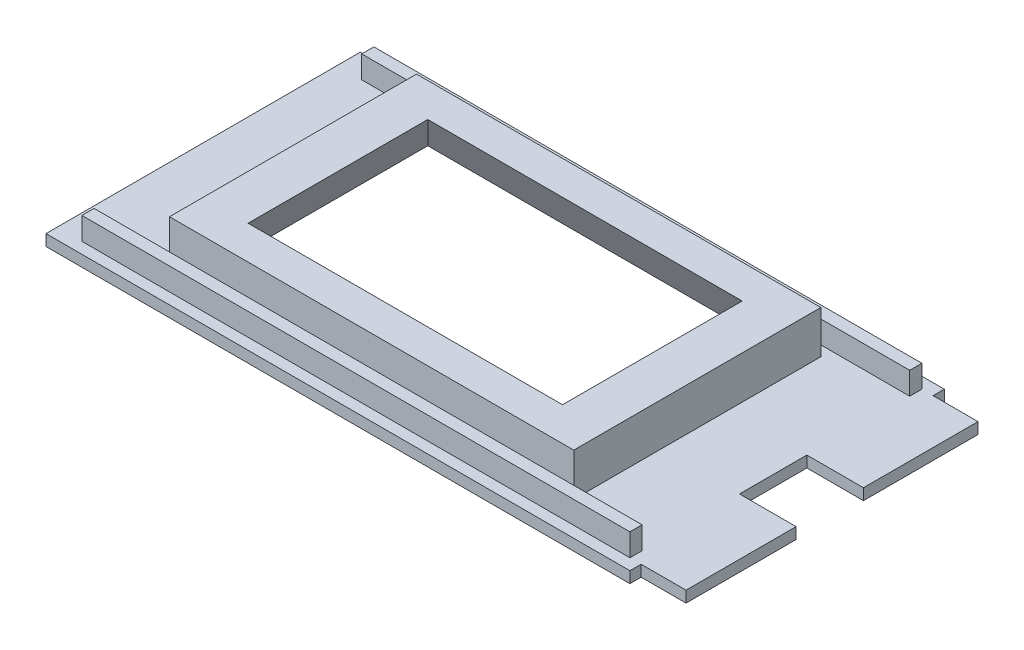
ISO-10303-21;
HEADER;
FILE_DESCRIPTION(('STEP AP214'),'2;1');
FILE_NAME('part.step','',(''),(''),'','','');
FILE_SCHEMA(('AUTOMOTIVE_DESIGN { 1 0 10303 214 1 1 1 1 }'));
ENDSEC;
DATA;
#1=APPLICATION_CONTEXT('core data for automotive mechanical design processes');
#2=APPLICATION_PROTOCOL_DEFINITION('international standard','automotive_design',2000,#1);
#3=PRODUCT_CONTEXT('',#1,'mechanical');
#4=PRODUCT('Part','Part','',(#3));
#5=PRODUCT_RELATED_PRODUCT_CATEGORY('part','',(#4));
#6=PRODUCT_DEFINITION_FORMATION('','',#4);
#7=PRODUCT_DEFINITION_CONTEXT('part definition',#1,'design');
#8=PRODUCT_DEFINITION('design','',#6,#7);
#9=PRODUCT_DEFINITION_SHAPE('','',#8);
#10=(LENGTH_UNIT() NAMED_UNIT(*) SI_UNIT(.MILLI.,.METRE.));
#11=(NAMED_UNIT(*) PLANE_ANGLE_UNIT() SI_UNIT($,.RADIAN.));
#12=(NAMED_UNIT(*) SI_UNIT($,.STERADIAN.) SOLID_ANGLE_UNIT());
#13=UNCERTAINTY_MEASURE_WITH_UNIT(LENGTH_MEASURE(1.E-05),#10,'distance_accuracy_value','');
#14=(GEOMETRIC_REPRESENTATION_CONTEXT(3) GLOBAL_UNCERTAINTY_ASSIGNED_CONTEXT((#13)) GLOBAL_UNIT_ASSIGNED_CONTEXT((#10,
#11,#12)) REPRESENTATION_CONTEXT('',''));
#15=CARTESIAN_POINT('',(0.,0.,0.));
#16=DIRECTION('',(0.,0.,1.));
#17=DIRECTION('',(1.,0.,0.));
#18=AXIS2_PLACEMENT_3D('',#15,#16,#17);
#19=CARTESIAN_POINT('',(0.,3.175,0.));
#20=DIRECTION('',(0.,-1.,0.));
#21=DIRECTION('',(0.,0.,-1.));
#22=AXIS2_PLACEMENT_3D('',#19,#20,#21);
#23=PLANE('',#22);
#24=DIRECTION('',(0.,0.,1.));
#25=VECTOR('',#24,1.);
#26=CARTESIAN_POINT('',(-75.565,3.175,41.275));
#27=LINE('',#26,#25);
#28=CARTESIAN_POINT('',(-75.565,3.175,37.8379198612695));
#29=VERTEX_POINT('',#28);
#30=CARTESIAN_POINT('',(-75.565,3.175,41.275));
#31=VERTEX_POINT('',#30);
#32=EDGE_CURVE('E317',#29,#31,#27,.T.);
#33=ORIENTED_EDGE('',*,*,#32,.F.);
#34=DIRECTION('',(-1.,0.,0.));
#35=VECTOR('',#34,1.);
#36=CARTESIAN_POINT('',(-75.565,3.175,37.8379198612695));
#37=LINE('',#36,#35);
#38=CARTESIAN_POINT('',(79.3749999999999,3.175,37.8379198612695));
#39=VERTEX_POINT('',#38);
#40=EDGE_CURVE('E323',#39,#29,#37,.T.);
#41=ORIENTED_EDGE('',*,*,#40,.F.);
#42=DIRECTION('',(0.,0.,-1.));
#43=VECTOR('',#42,1.);
#44=CARTESIAN_POINT('',(79.3749999999999,3.175,41.275));
#45=LINE('',#44,#43);
#46=CARTESIAN_POINT('',(79.3749999999999,3.175,41.275));
#47=VERTEX_POINT('',#46);
#48=EDGE_CURVE('E340',#47,#39,#45,.T.);
#49=ORIENTED_EDGE('',*,*,#48,.F.);
#50=DIRECTION('',(1.,0.,0.));
#51=VECTOR('',#50,1.);
#52=CARTESIAN_POINT('',(-75.565,3.175,41.275));
#53=LINE('',#52,#51);
#54=EDGE_CURVE('E336',#31,#47,#53,.T.);
#55=ORIENTED_EDGE('',*,*,#54,.F.);
#56=EDGE_LOOP('',(#33,#41,#49,#55));
#57=FACE_BOUND('',#56,.T.);
#58=DIRECTION('',(0.,0.,1.));
#59=VECTOR('',#58,1.);
#60=CARTESIAN_POINT('',(79.248,3.17499999999999,-8.89));
#61=LINE('',#60,#59);
#62=CARTESIAN_POINT('',(79.248,3.17499999999999,-8.89));
#63=VERTEX_POINT('',#62);
#64=CARTESIAN_POINT('',(79.248,3.17500000000003,10.16));
#65=VERTEX_POINT('',#64);
#66=EDGE_CURVE('E412',#63,#65,#61,.T.);
#67=ORIENTED_EDGE('',*,*,#66,.F.);
#68=DIRECTION('',(1.,0.,0.));
#69=VECTOR('',#68,1.);
#70=CARTESIAN_POINT('',(79.248,3.17499999999999,-8.89));
#71=LINE('',#70,#69);
#72=CARTESIAN_POINT('',(95.25,3.17499999999999,-8.89));
#73=VERTEX_POINT('',#72);
#74=EDGE_CURVE('E425',#63,#73,#71,.T.);
#75=ORIENTED_EDGE('',*,*,#74,.T.);
#76=DIRECTION('',(0.,0.,1.));
#77=VECTOR('',#76,1.);
#78=CARTESIAN_POINT('',(95.25,3.17500000000003,-41.275));
#79=LINE('',#78,#77);
#80=CARTESIAN_POINT('',(95.25,3.17500000000003,-41.275));
#81=VERTEX_POINT('',#80);
#82=EDGE_CURVE('E450',#81,#73,#79,.T.);
#83=ORIENTED_EDGE('',*,*,#82,.F.);
#84=DIRECTION('',(-1.,0.,0.));
#85=VECTOR('',#84,1.);
#86=CARTESIAN_POINT('',(95.25,3.17500000000003,-41.275));
#87=LINE('',#86,#85);
#88=CARTESIAN_POINT('',(82.55,3.175,-41.275));
#89=VERTEX_POINT('',#88);
#90=EDGE_CURVE('E480',#81,#89,#87,.T.);
#91=ORIENTED_EDGE('',*,*,#90,.T.);
#92=DIRECTION('',(0.,0.,-1.));
#93=VECTOR('',#92,1.);
#94=CARTESIAN_POINT('',(82.55,3.175,44.45));
#95=LINE('',#94,#93);
#96=CARTESIAN_POINT('',(82.55,3.175,-44.45));
#97=VERTEX_POINT('',#96);
#98=EDGE_CURVE('E490',#89,#97,#95,.T.);
#99=ORIENTED_EDGE('',*,*,#98,.T.);
#100=DIRECTION('',(-1.,0.,0.));
#101=VECTOR('',#100,1.);
#102=CARTESIAN_POINT('',(-82.55,3.175,-44.45));
#103=LINE('',#102,#101);
#104=CARTESIAN_POINT('',(-82.55,3.175,-44.45));
#105=VERTEX_POINT('',#104);
#106=EDGE_CURVE('E489',#97,#105,#103,.T.);
#107=ORIENTED_EDGE('',*,*,#106,.T.);
#108=DIRECTION('',(0.,0.,1.));
#109=VECTOR('',#108,1.);
#110=CARTESIAN_POINT('',(-82.55,3.175,44.45));
#111=LINE('',#110,#109);
#112=CARTESIAN_POINT('',(-82.55,3.175,44.45));
#113=VERTEX_POINT('',#112);
#114=EDGE_CURVE('E493',#105,#113,#111,.T.);
#115=ORIENTED_EDGE('',*,*,#114,.T.);
#116=DIRECTION('',(1.,0.,0.));
#117=VECTOR('',#116,1.);
#118=CARTESIAN_POINT('',(-82.55,3.175,44.45));
#119=LINE('',#118,#117);
#120=CARTESIAN_POINT('',(82.55,3.175,44.45));
#121=VERTEX_POINT('',#120);
#122=EDGE_CURVE('E496',#113,#121,#119,.T.);
#123=ORIENTED_EDGE('',*,*,#122,.T.);
#124=CARTESIAN_POINT('',(82.55,3.175,41.275));
#125=VERTEX_POINT('',#124);
#126=EDGE_CURVE('E485',#121,#125,#95,.T.);
#127=ORIENTED_EDGE('',*,*,#126,.T.);
#128=DIRECTION('',(-1.,0.,0.));
#129=VECTOR('',#128,1.);
#130=CARTESIAN_POINT('',(95.25,3.17499999999998,41.275));
#131=LINE('',#130,#129);
#132=CARTESIAN_POINT('',(95.25,3.17499999999998,41.275));
#133=VERTEX_POINT('',#132);
#134=EDGE_CURVE('E476',#133,#125,#131,.T.);
#135=ORIENTED_EDGE('',*,*,#134,.F.);
#136=CARTESIAN_POINT('',(95.25,3.17499999999999,10.16));
#137=VERTEX_POINT('',#136);
#138=EDGE_CURVE('E448',#137,#133,#79,.T.);
#139=ORIENTED_EDGE('',*,*,#138,.F.);
#140=DIRECTION('',(1.,0.,0.));
#141=VECTOR('',#140,1.);
#142=CARTESIAN_POINT('',(79.248,3.17500000000003,10.16));
#143=LINE('',#142,#141);
#144=EDGE_CURVE('E438',#65,#137,#143,.T.);
#145=ORIENTED_EDGE('',*,*,#144,.F.);
#146=EDGE_LOOP('',(#67,#75,#83,#91,#99,#107,#115,#123,#127,#135,#139,#145));
#147=FACE_BOUND('',#146,.T.);
#148=DIRECTION('',(0.,0.,1.));
#149=VECTOR('',#148,1.);
#150=CARTESIAN_POINT('',(-75.565,3.175,-41.275));
#151=LINE('',#150,#149);
#152=CARTESIAN_POINT('',(-75.565,3.175,-41.275));
#153=VERTEX_POINT('',#152);
#154=CARTESIAN_POINT('',(-75.565,3.175,-37.8379198612695));
#155=VERTEX_POINT('',#154);
#156=EDGE_CURVE('E362',#153,#155,#151,.T.);
#157=ORIENTED_EDGE('',*,*,#156,.F.);
#158=DIRECTION('',(-1.,0.,0.));
#159=VECTOR('',#158,1.);
#160=CARTESIAN_POINT('',(-75.565,3.175,-41.275));
#161=LINE('',#160,#159);
#162=CARTESIAN_POINT('',(79.375,3.175,-41.275));
#163=VERTEX_POINT('',#162);
#164=EDGE_CURVE('E368',#163,#153,#161,.T.);
#165=ORIENTED_EDGE('',*,*,#164,.F.);
#166=DIRECTION('',(0.,0.,-1.));
#167=VECTOR('',#166,1.);
#168=CARTESIAN_POINT('',(79.375,3.175,-41.275));
#169=LINE('',#168,#167);
#170=CARTESIAN_POINT('',(79.375,3.175,-37.8379198612695));
#171=VERTEX_POINT('',#170);
#172=EDGE_CURVE('E385',#171,#163,#169,.T.);
#173=ORIENTED_EDGE('',*,*,#172,.F.);
#174=DIRECTION('',(1.,0.,0.));
#175=VECTOR('',#174,1.);
#176=CARTESIAN_POINT('',(-75.565,3.175,-37.8379198612695));
#177=LINE('',#176,#175);
#178=EDGE_CURVE('E381',#155,#171,#177,.T.);
#179=ORIENTED_EDGE('',*,*,#178,.F.);
#180=EDGE_LOOP('',(#157,#165,#173,#179));
#181=FACE_BOUND('',#180,.T.);
#182=DIRECTION('',(0.,0.,-1.));
#183=VECTOR('',#182,1.);
#184=CARTESIAN_POINT('',(57.15,3.175,0.));
#185=LINE('',#184,#183);
#186=CARTESIAN_POINT('',(57.15,3.175,34.925));
#187=VERTEX_POINT('',#186);
#188=CARTESIAN_POINT('',(57.15,3.175,-34.925));
#189=VERTEX_POINT('',#188);
#190=EDGE_CURVE('E313',#187,#189,#185,.T.);
#191=ORIENTED_EDGE('',*,*,#190,.F.);
#192=DIRECTION('',(1.,0.,0.));
#193=VECTOR('',#192,1.);
#194=CARTESIAN_POINT('',(0.,3.175,34.925));
#195=LINE('',#194,#193);
#196=CARTESIAN_POINT('',(-57.15,3.175,34.925));
#197=VERTEX_POINT('',#196);
#198=EDGE_CURVE('E301',#197,#187,#195,.T.);
#199=ORIENTED_EDGE('',*,*,#198,.F.);
#200=DIRECTION('',(0.,0.,1.));
#201=VECTOR('',#200,1.);
#202=CARTESIAN_POINT('',(-57.15,3.175,0.));
#203=LINE('',#202,#201);
#204=CARTESIAN_POINT('',(-57.15,3.175,-34.925));
#205=VERTEX_POINT('',#204);
#206=EDGE_CURVE('E305',#205,#197,#203,.T.);
#207=ORIENTED_EDGE('',*,*,#206,.F.);
#208=DIRECTION('',(-1.,0.,0.));
#209=VECTOR('',#208,1.);
#210=CARTESIAN_POINT('',(0.,3.175,-34.925));
#211=LINE('',#210,#209);
#212=EDGE_CURVE('E309',#189,#205,#211,.T.);
#213=ORIENTED_EDGE('',*,*,#212,.F.);
#214=EDGE_LOOP('',(#191,#199,#207,#213));
#215=FACE_BOUND('',#214,.T.);
#216=ADVANCED_FACE('F39',(#57,#147,#181,#215),#23,.F.);
#217=CARTESIAN_POINT('',(95.25,0.,0.));
#218=DIRECTION('',(-1.,0.,0.));
#219=DIRECTION('',(0.,0.,1.));
#220=AXIS2_PLACEMENT_3D('',#217,#218,#219);
#221=PLANE('',#220);
#222=ORIENTED_EDGE('',*,*,#82,.T.);
#223=DIRECTION('',(0.,1.,0.));
#224=VECTOR('',#223,1.);
#225=CARTESIAN_POINT('',(95.25,0.,-8.89));
#226=LINE('',#225,#224);
#227=CARTESIAN_POINT('',(95.25,0.,-8.89));
#228=VERTEX_POINT('',#227);
#229=EDGE_CURVE('E407',#228,#73,#226,.T.);
#230=ORIENTED_EDGE('',*,*,#229,.F.);
#231=DIRECTION('',(0.,0.,-1.));
#232=VECTOR('',#231,1.);
#233=CARTESIAN_POINT('',(95.25,0.,-41.275));
#234=LINE('',#233,#232);
#235=CARTESIAN_POINT('',(95.25,0.,-41.275));
#236=VERTEX_POINT('',#235);
#237=EDGE_CURVE('E457',#228,#236,#234,.T.);
#238=ORIENTED_EDGE('',*,*,#237,.T.);
#239=DIRECTION('',(0.,1.,0.));
#240=VECTOR('',#239,1.);
#241=CARTESIAN_POINT('',(95.25,3.17500000000003,-41.275));
#242=LINE('',#241,#240);
#243=EDGE_CURVE('E444',#236,#81,#242,.T.);
#244=ORIENTED_EDGE('',*,*,#243,.T.);
#245=EDGE_LOOP('',(#222,#230,#238,#244));
#246=FACE_BOUND('',#245,.T.);
#247=ADVANCED_FACE('F570',(#246),#221,.F.);
#248=CARTESIAN_POINT('',(82.55,3.175,44.45));
#249=DIRECTION('',(-1.,0.,0.));
#250=DIRECTION('',(0.,0.,1.));
#251=AXIS2_PLACEMENT_3D('',#248,#249,#250);
#252=PLANE('',#251);
#253=DIRECTION('',(0.,1.,0.));
#254=VECTOR('',#253,1.);
#255=CARTESIAN_POINT('',(82.55,3.17500000000003,-41.275));
#256=LINE('',#255,#254);
#257=CARTESIAN_POINT('',(82.55,0.,-41.275));
#258=VERTEX_POINT('',#257);
#259=EDGE_CURVE('E433',#258,#89,#256,.T.);
#260=ORIENTED_EDGE('',*,*,#259,.F.);
#261=DIRECTION('',(0.,0.,-1.));
#262=VECTOR('',#261,1.);
#263=CARTESIAN_POINT('',(82.55,0.,44.45));
#264=LINE('',#263,#262);
#265=CARTESIAN_POINT('',(82.55,0.,-44.45));
#266=VERTEX_POINT('',#265);
#267=EDGE_CURVE('E484',#258,#266,#264,.T.);
#268=ORIENTED_EDGE('',*,*,#267,.T.);
#269=DIRECTION('',(0.,-1.,0.));
#270=VECTOR('',#269,1.);
#271=CARTESIAN_POINT('',(82.55,3.175,-44.45));
#272=LINE('',#271,#270);
#273=EDGE_CURVE('E11',#97,#266,#272,.T.);
#274=ORIENTED_EDGE('',*,*,#273,.F.);
#275=ORIENTED_EDGE('',*,*,#98,.F.);
#276=EDGE_LOOP('',(#260,#268,#274,#275));
#277=FACE_BOUND('',#276,.T.);
#278=ADVANCED_FACE('F41',(#277),#252,.F.);
#279=DIRECTION('',(0.,-1.,0.));
#280=VECTOR('',#279,1.);
#281=CARTESIAN_POINT('',(82.55,3.17499999999998,41.275));
#282=LINE('',#281,#280);
#283=CARTESIAN_POINT('',(82.55,0.,41.275));
#284=VERTEX_POINT('',#283);
#285=EDGE_CURVE('E449',#125,#284,#282,.T.);
#286=ORIENTED_EDGE('',*,*,#285,.F.);
#287=ORIENTED_EDGE('',*,*,#126,.F.);
#288=DIRECTION('',(0.,-1.,0.));
#289=VECTOR('',#288,1.);
#290=CARTESIAN_POINT('',(82.55,3.175,44.45));
#291=LINE('',#290,#289);
#292=CARTESIAN_POINT('',(82.55,0.,44.45));
#293=VERTEX_POINT('',#292);
#294=EDGE_CURVE('E499',#121,#293,#291,.T.);
#295=ORIENTED_EDGE('',*,*,#294,.T.);
#296=EDGE_CURVE('E500',#293,#284,#264,.T.);
#297=ORIENTED_EDGE('',*,*,#296,.T.);
#298=EDGE_LOOP('',(#286,#287,#295,#297));
#299=FACE_BOUND('',#298,.T.);
#300=ADVANCED_FACE('F541',(#299),#252,.F.);
#301=CARTESIAN_POINT('',(-82.55,3.175,-44.45));
#302=DIRECTION('',(0.,0.,1.));
#303=DIRECTION('',(1.,0.,0.));
#304=AXIS2_PLACEMENT_3D('',#301,#302,#303);
#305=PLANE('',#304);
#306=DIRECTION('',(-1.,0.,0.));
#307=VECTOR('',#306,1.);
#308=CARTESIAN_POINT('',(-82.55,0.,-44.45));
#309=LINE('',#308,#307);
#310=CARTESIAN_POINT('',(-82.55,0.,-44.45));
#311=VERTEX_POINT('',#310);
#312=EDGE_CURVE('E503',#266,#311,#309,.T.);
#313=ORIENTED_EDGE('',*,*,#312,.T.);
#314=DIRECTION('',(0.,-1.,0.));
#315=VECTOR('',#314,1.);
#316=CARTESIAN_POINT('',(-82.55,3.175,-44.45));
#317=LINE('',#316,#315);
#318=EDGE_CURVE('E48',#105,#311,#317,.T.);
#319=ORIENTED_EDGE('',*,*,#318,.F.);
#320=ORIENTED_EDGE('',*,*,#106,.F.);
#321=ORIENTED_EDGE('',*,*,#273,.T.);
#322=EDGE_LOOP('',(#313,#319,#320,#321));
#323=FACE_BOUND('',#322,.T.);
#324=ADVANCED_FACE('F563',(#323),#305,.F.);
#325=CARTESIAN_POINT('',(-82.55,3.175,44.45));
#326=DIRECTION('',(1.,0.,0.));
#327=DIRECTION('',(0.,0.,-1.));
#328=AXIS2_PLACEMENT_3D('',#325,#326,#327);
#329=PLANE('',#328);
#330=DIRECTION('',(0.,0.,1.));
#331=VECTOR('',#330,1.);
#332=CARTESIAN_POINT('',(-82.55,0.,44.45));
#333=LINE('',#332,#331);
#334=CARTESIAN_POINT('',(-82.55,0.,44.45));
#335=VERTEX_POINT('',#334);
#336=EDGE_CURVE('E506',#311,#335,#333,.T.);
#337=ORIENTED_EDGE('',*,*,#336,.T.);
#338=DIRECTION('',(0.,-1.,0.));
#339=VECTOR('',#338,1.);
#340=CARTESIAN_POINT('',(-82.55,3.175,44.45));
#341=LINE('',#340,#339);
#342=EDGE_CURVE('E515',#113,#335,#341,.T.);
#343=ORIENTED_EDGE('',*,*,#342,.F.);
#344=ORIENTED_EDGE('',*,*,#114,.F.);
#345=ORIENTED_EDGE('',*,*,#318,.T.);
#346=EDGE_LOOP('',(#337,#343,#344,#345));
#347=FACE_BOUND('',#346,.T.);
#348=ADVANCED_FACE('F524',(#347),#329,.F.);
#349=CARTESIAN_POINT('',(-82.55,3.175,44.45));
#350=DIRECTION('',(0.,0.,-1.));
#351=DIRECTION('',(-1.,0.,0.));
#352=AXIS2_PLACEMENT_3D('',#349,#350,#351);
#353=PLANE('',#352);
#354=DIRECTION('',(1.,0.,0.));
#355=VECTOR('',#354,1.);
#356=CARTESIAN_POINT('',(-82.55,0.,44.45));
#357=LINE('',#356,#355);
#358=EDGE_CURVE('E509',#335,#293,#357,.T.);
#359=ORIENTED_EDGE('',*,*,#358,.T.);
#360=ORIENTED_EDGE('',*,*,#294,.F.);
#361=ORIENTED_EDGE('',*,*,#122,.F.);
#362=ORIENTED_EDGE('',*,*,#342,.T.);
#363=EDGE_LOOP('',(#359,#360,#361,#362));
#364=FACE_BOUND('',#363,.T.);
#365=ADVANCED_FACE('F537',(#364),#353,.F.);
#366=CARTESIAN_POINT('',(0.,0.,0.));
#367=DIRECTION('',(0.,-1.,0.));
#368=DIRECTION('',(0.,0.,-1.));
#369=AXIS2_PLACEMENT_3D('',#366,#367,#368);
#370=PLANE('',#369);
#371=DIRECTION('',(0.,0.,-1.));
#372=VECTOR('',#371,1.);
#373=CARTESIAN_POINT('',(53.2488181024499,0.,0.));
#374=LINE('',#373,#372);
#375=CARTESIAN_POINT('',(53.2488181024499,0.,34.1988181024499));
#376=VERTEX_POINT('',#375);
#377=CARTESIAN_POINT('',(53.2488181024499,0.,-34.1988181024499));
#378=VERTEX_POINT('',#377);
#379=EDGE_CURVE('E249',#376,#378,#374,.T.);
#380=ORIENTED_EDGE('',*,*,#379,.T.);
#381=DIRECTION('',(-1.,0.,0.));
#382=VECTOR('',#381,1.);
#383=CARTESIAN_POINT('',(0.,0.,-34.1988181024499));
#384=LINE('',#383,#382);
#385=CARTESIAN_POINT('',(-53.2488181024499,0.,-34.1988181024499));
#386=VERTEX_POINT('',#385);
#387=EDGE_CURVE('E265',#378,#386,#384,.T.);
#388=ORIENTED_EDGE('',*,*,#387,.T.);
#389=DIRECTION('',(0.,0.,1.));
#390=VECTOR('',#389,1.);
#391=CARTESIAN_POINT('',(-53.2488181024499,0.,0.));
#392=LINE('',#391,#390);
#393=CARTESIAN_POINT('',(-53.2488181024499,0.,34.1988181024499));
#394=VERTEX_POINT('',#393);
#395=EDGE_CURVE('E55',#386,#394,#392,.T.);
#396=ORIENTED_EDGE('',*,*,#395,.T.);
#397=DIRECTION('',(1.,0.,0.));
#398=VECTOR('',#397,1.);
#399=CARTESIAN_POINT('',(0.,0.,34.1988181024499));
#400=LINE('',#399,#398);
#401=EDGE_CURVE('E258',#394,#376,#400,.T.);
#402=ORIENTED_EDGE('',*,*,#401,.T.);
#403=EDGE_LOOP('',(#380,#388,#396,#402));
#404=FACE_BOUND('',#403,.T.);
#405=DIRECTION('',(1.,0.,0.));
#406=VECTOR('',#405,1.);
#407=CARTESIAN_POINT('',(79.248,0.,-8.89));
#408=LINE('',#407,#406);
#409=CARTESIAN_POINT('',(79.248,0.,-8.89));
#410=VERTEX_POINT('',#409);
#411=EDGE_CURVE('E430',#410,#228,#408,.T.);
#412=ORIENTED_EDGE('',*,*,#411,.F.);
#413=DIRECTION('',(0.,0.,-1.));
#414=VECTOR('',#413,1.);
#415=CARTESIAN_POINT('',(79.248,0.,-8.89));
#416=LINE('',#415,#414);
#417=CARTESIAN_POINT('',(79.248,0.,10.16));
#418=VERTEX_POINT('',#417);
#419=EDGE_CURVE('E421',#418,#410,#416,.T.);
#420=ORIENTED_EDGE('',*,*,#419,.F.);
#421=DIRECTION('',(1.,0.,0.));
#422=VECTOR('',#421,1.);
#423=CARTESIAN_POINT('',(79.248,0.,10.16));
#424=LINE('',#423,#422);
#425=CARTESIAN_POINT('',(95.25,0.,10.16));
#426=VERTEX_POINT('',#425);
#427=EDGE_CURVE('E434',#418,#426,#424,.T.);
#428=ORIENTED_EDGE('',*,*,#427,.T.);
#429=CARTESIAN_POINT('',(95.25,0.,41.275));
#430=VERTEX_POINT('',#429);
#431=EDGE_CURVE('E458',#430,#426,#234,.T.);
#432=ORIENTED_EDGE('',*,*,#431,.F.);
#433=DIRECTION('',(-1.,0.,0.));
#434=VECTOR('',#433,1.);
#435=CARTESIAN_POINT('',(95.25,0.,41.275));
#436=LINE('',#435,#434);
#437=EDGE_CURVE('E472',#430,#284,#436,.T.);
#438=ORIENTED_EDGE('',*,*,#437,.T.);
#439=ORIENTED_EDGE('',*,*,#296,.F.);
#440=ORIENTED_EDGE('',*,*,#358,.F.);
#441=ORIENTED_EDGE('',*,*,#336,.F.);
#442=ORIENTED_EDGE('',*,*,#312,.F.);
#443=ORIENTED_EDGE('',*,*,#267,.F.);
#444=DIRECTION('',(-1.,0.,0.));
#445=VECTOR('',#444,1.);
#446=CARTESIAN_POINT('',(95.25,0.,-41.275));
#447=LINE('',#446,#445);
#448=EDGE_CURVE('E462',#236,#258,#447,.T.);
#449=ORIENTED_EDGE('',*,*,#448,.F.);
#450=ORIENTED_EDGE('',*,*,#237,.F.);
#451=EDGE_LOOP('',(#412,#420,#428,#432,#438,#439,#440,#441,#442,#443,#449,#450));
#452=FACE_BOUND('',#451,.T.);
#453=ADVANCED_FACE('F532',(#404,#452),#370,.T.);
#454=CARTESIAN_POINT('',(95.25,3.17500000000003,-41.275));
#455=DIRECTION('',(0.,0.,1.));
#456=DIRECTION('',(1.,0.,0.));
#457=AXIS2_PLACEMENT_3D('',#454,#455,#456);
#458=PLANE('',#457);
#459=ORIENTED_EDGE('',*,*,#259,.T.);
#460=ORIENTED_EDGE('',*,*,#90,.F.);
#461=ORIENTED_EDGE('',*,*,#243,.F.);
#462=ORIENTED_EDGE('',*,*,#448,.T.);
#463=EDGE_LOOP('',(#459,#460,#461,#462));
#464=FACE_BOUND('',#463,.T.);
#465=ADVANCED_FACE('F568',(#464),#458,.F.);
#466=CARTESIAN_POINT('',(95.25,3.17499999999998,41.275));
#467=DIRECTION('',(0.,0.,-1.));
#468=DIRECTION('',(-1.,0.,0.));
#469=AXIS2_PLACEMENT_3D('',#466,#467,#468);
#470=PLANE('',#469);
#471=ORIENTED_EDGE('',*,*,#285,.T.);
#472=ORIENTED_EDGE('',*,*,#437,.F.);
#473=DIRECTION('',(0.,-1.,0.));
#474=VECTOR('',#473,1.);
#475=CARTESIAN_POINT('',(95.25,3.17499999999998,41.275));
#476=LINE('',#475,#474);
#477=EDGE_CURVE('E454',#133,#430,#476,.T.);
#478=ORIENTED_EDGE('',*,*,#477,.F.);
#479=ORIENTED_EDGE('',*,*,#134,.T.);
#480=EDGE_LOOP('',(#471,#472,#478,#479));
#481=FACE_BOUND('',#480,.T.);
#482=ADVANCED_FACE('F549',(#481),#470,.F.);
#483=ORIENTED_EDGE('',*,*,#431,.T.);
#484=DIRECTION('',(0.,-1.,0.));
#485=VECTOR('',#484,1.);
#486=CARTESIAN_POINT('',(95.25,0.,10.16));
#487=LINE('',#486,#485);
#488=EDGE_CURVE('E413',#137,#426,#487,.T.);
#489=ORIENTED_EDGE('',*,*,#488,.F.);
#490=ORIENTED_EDGE('',*,*,#138,.T.);
#491=ORIENTED_EDGE('',*,*,#477,.T.);
#492=EDGE_LOOP('',(#483,#489,#490,#491));
#493=FACE_BOUND('',#492,.T.);
#494=ADVANCED_FACE('F553',(#493),#221,.F.);
#495=CARTESIAN_POINT('',(79.248,0.,-8.89));
#496=DIRECTION('',(0.,0.,-1.));
#497=DIRECTION('',(-1.,0.,0.));
#498=AXIS2_PLACEMENT_3D('',#495,#496,#497);
#499=PLANE('',#498);
#500=ORIENTED_EDGE('',*,*,#229,.T.);
#501=ORIENTED_EDGE('',*,*,#74,.F.);
#502=DIRECTION('',(0.,1.,0.));
#503=VECTOR('',#502,1.);
#504=CARTESIAN_POINT('',(79.248,0.,-8.89));
#505=LINE('',#504,#503);
#506=EDGE_CURVE('E408',#410,#63,#505,.T.);
#507=ORIENTED_EDGE('',*,*,#506,.F.);
#508=ORIENTED_EDGE('',*,*,#411,.T.);
#509=EDGE_LOOP('',(#500,#501,#507,#508));
#510=FACE_BOUND('',#509,.T.);
#511=ADVANCED_FACE('F574',(#510),#499,.F.);
#512=CARTESIAN_POINT('',(79.248,0.,10.16));
#513=DIRECTION('',(0.,0.,1.));
#514=DIRECTION('',(1.,0.,0.));
#515=AXIS2_PLACEMENT_3D('',#512,#513,#514);
#516=PLANE('',#515);
#517=ORIENTED_EDGE('',*,*,#488,.T.);
#518=ORIENTED_EDGE('',*,*,#427,.F.);
#519=DIRECTION('',(0.,-1.,0.));
#520=VECTOR('',#519,1.);
#521=CARTESIAN_POINT('',(79.248,0.,10.16));
#522=LINE('',#521,#520);
#523=EDGE_CURVE('E417',#65,#418,#522,.T.);
#524=ORIENTED_EDGE('',*,*,#523,.F.);
#525=ORIENTED_EDGE('',*,*,#144,.T.);
#526=EDGE_LOOP('',(#517,#518,#524,#525));
#527=FACE_BOUND('',#526,.T.);
#528=ADVANCED_FACE('F578',(#527),#516,.F.);
#529=CARTESIAN_POINT('',(79.248,0.,0.));
#530=DIRECTION('',(1.,0.,0.));
#531=DIRECTION('',(0.,0.,-1.));
#532=AXIS2_PLACEMENT_3D('',#529,#530,#531);
#533=PLANE('',#532);
#534=ORIENTED_EDGE('',*,*,#506,.T.);
#535=ORIENTED_EDGE('',*,*,#66,.T.);
#536=ORIENTED_EDGE('',*,*,#523,.T.);
#537=ORIENTED_EDGE('',*,*,#419,.T.);
#538=EDGE_LOOP('',(#534,#535,#536,#537));
#539=FACE_BOUND('',#538,.T.);
#540=ADVANCED_FACE('F576',(#539),#533,.T.);
#541=CARTESIAN_POINT('',(-75.565,9.525,-41.275));
#542=DIRECTION('',(1.,0.,0.));
#543=DIRECTION('',(0.,0.,-1.));
#544=AXIS2_PLACEMENT_3D('',#541,#542,#543);
#545=PLANE('',#544);
#546=ORIENTED_EDGE('',*,*,#156,.T.);
#547=DIRECTION('',(0.,-1.,0.));
#548=VECTOR('',#547,1.);
#549=CARTESIAN_POINT('',(-75.565,9.525,-37.8379198612695));
#550=LINE('',#549,#548);
#551=CARTESIAN_POINT('',(-75.565,9.525,-37.8379198612695));
#552=VERTEX_POINT('',#551);
#553=EDGE_CURVE('E403',#552,#155,#550,.T.);
#554=ORIENTED_EDGE('',*,*,#553,.F.);
#555=DIRECTION('',(0.,0.,1.));
#556=VECTOR('',#555,1.);
#557=CARTESIAN_POINT('',(-75.565,9.525,-41.275));
#558=LINE('',#557,#556);
#559=CARTESIAN_POINT('',(-75.565,9.525,-41.275));
#560=VERTEX_POINT('',#559);
#561=EDGE_CURVE('E363',#560,#552,#558,.T.);
#562=ORIENTED_EDGE('',*,*,#561,.F.);
#563=DIRECTION('',(0.,-1.,0.));
#564=VECTOR('',#563,1.);
#565=CARTESIAN_POINT('',(-75.565,9.525,-41.275));
#566=LINE('',#565,#564);
#567=EDGE_CURVE('E377',#560,#153,#566,.T.);
#568=ORIENTED_EDGE('',*,*,#567,.T.);
#569=EDGE_LOOP('',(#546,#554,#562,#568));
#570=FACE_BOUND('',#569,.T.);
#571=ADVANCED_FACE('F585',(#570),#545,.F.);
#572=CARTESIAN_POINT('',(-75.565,9.525,-37.8379198612695));
#573=DIRECTION('',(0.,0.,-1.));
#574=DIRECTION('',(-1.,0.,0.));
#575=AXIS2_PLACEMENT_3D('',#572,#573,#574);
#576=PLANE('',#575);
#577=ORIENTED_EDGE('',*,*,#178,.T.);
#578=DIRECTION('',(0.,-1.,0.));
#579=VECTOR('',#578,1.);
#580=CARTESIAN_POINT('',(79.375,9.525,-37.8379198612695));
#581=LINE('',#580,#579);
#582=CARTESIAN_POINT('',(79.375,9.525,-37.8379198612695));
#583=VERTEX_POINT('',#582);
#584=EDGE_CURVE('E399',#583,#171,#581,.T.);
#585=ORIENTED_EDGE('',*,*,#584,.F.);
#586=DIRECTION('',(1.,0.,0.));
#587=VECTOR('',#586,1.);
#588=CARTESIAN_POINT('',(-75.565,9.525,-37.8379198612695));
#589=LINE('',#588,#587);
#590=EDGE_CURVE('E367',#552,#583,#589,.T.);
#591=ORIENTED_EDGE('',*,*,#590,.F.);
#592=ORIENTED_EDGE('',*,*,#553,.T.);
#593=EDGE_LOOP('',(#577,#585,#591,#592));
#594=FACE_BOUND('',#593,.T.);
#595=ADVANCED_FACE('F655',(#594),#576,.F.);
#596=CARTESIAN_POINT('',(79.375,9.525,-41.275));
#597=DIRECTION('',(-1.,0.,0.));
#598=DIRECTION('',(0.,0.,1.));
#599=AXIS2_PLACEMENT_3D('',#596,#597,#598);
#600=PLANE('',#599);
#601=ORIENTED_EDGE('',*,*,#172,.T.);
#602=DIRECTION('',(0.,-1.,0.));
#603=VECTOR('',#602,1.);
#604=CARTESIAN_POINT('',(79.375,9.525,-41.275));
#605=LINE('',#604,#603);
#606=CARTESIAN_POINT('',(79.375,9.525,-41.275));
#607=VERTEX_POINT('',#606);
#608=EDGE_CURVE('E395',#607,#163,#605,.T.);
#609=ORIENTED_EDGE('',*,*,#608,.F.);
#610=DIRECTION('',(0.,0.,-1.));
#611=VECTOR('',#610,1.);
#612=CARTESIAN_POINT('',(79.375,9.525,-41.275));
#613=LINE('',#612,#611);
#614=EDGE_CURVE('E371',#583,#607,#613,.T.);
#615=ORIENTED_EDGE('',*,*,#614,.F.);
#616=ORIENTED_EDGE('',*,*,#584,.T.);
#617=EDGE_LOOP('',(#601,#609,#615,#616));
#618=FACE_BOUND('',#617,.T.);
#619=ADVANCED_FACE('F665',(#618),#600,.F.);
#620=CARTESIAN_POINT('',(-75.565,9.525,-41.275));
#621=DIRECTION('',(0.,0.,1.));
#622=DIRECTION('',(1.,0.,0.));
#623=AXIS2_PLACEMENT_3D('',#620,#621,#622);
#624=PLANE('',#623);
#625=ORIENTED_EDGE('',*,*,#164,.T.);
#626=ORIENTED_EDGE('',*,*,#567,.F.);
#627=DIRECTION('',(-1.,0.,0.));
#628=VECTOR('',#627,1.);
#629=CARTESIAN_POINT('',(-75.565,9.525,-41.275));
#630=LINE('',#629,#628);
#631=EDGE_CURVE('E374',#607,#560,#630,.T.);
#632=ORIENTED_EDGE('',*,*,#631,.F.);
#633=ORIENTED_EDGE('',*,*,#608,.T.);
#634=EDGE_LOOP('',(#625,#626,#632,#633));
#635=FACE_BOUND('',#634,.T.);
#636=ADVANCED_FACE('F675',(#635),#624,.F.);
#637=CARTESIAN_POINT('',(0.,9.525,0.));
#638=DIRECTION('',(0.,1.,0.));
#639=DIRECTION('',(0.,0.,1.));
#640=AXIS2_PLACEMENT_3D('',#637,#638,#639);
#641=PLANE('',#640);
#642=ORIENTED_EDGE('',*,*,#561,.T.);
#643=ORIENTED_EDGE('',*,*,#590,.T.);
#644=ORIENTED_EDGE('',*,*,#614,.T.);
#645=ORIENTED_EDGE('',*,*,#631,.T.);
#646=EDGE_LOOP('',(#642,#643,#644,#645));
#647=FACE_BOUND('',#646,.T.);
#648=ADVANCED_FACE('F685',(#647),#641,.T.);
#649=CARTESIAN_POINT('',(-75.565,9.525,41.275));
#650=DIRECTION('',(1.,0.,0.));
#651=DIRECTION('',(0.,0.,-1.));
#652=AXIS2_PLACEMENT_3D('',#649,#650,#651);
#653=PLANE('',#652);
#654=ORIENTED_EDGE('',*,*,#32,.T.);
#655=DIRECTION('',(0.,-1.,0.));
#656=VECTOR('',#655,1.);
#657=CARTESIAN_POINT('',(-75.565,9.525,41.275));
#658=LINE('',#657,#656);
#659=CARTESIAN_POINT('',(-75.565,9.525,41.275));
#660=VERTEX_POINT('',#659);
#661=EDGE_CURVE('E358',#660,#31,#658,.T.);
#662=ORIENTED_EDGE('',*,*,#661,.F.);
#663=DIRECTION('',(0.,0.,1.));
#664=VECTOR('',#663,1.);
#665=CARTESIAN_POINT('',(-75.565,9.525,41.275));
#666=LINE('',#665,#664);
#667=CARTESIAN_POINT('',(-75.565,9.525,37.8379198612695));
#668=VERTEX_POINT('',#667);
#669=EDGE_CURVE('E318',#668,#660,#666,.T.);
#670=ORIENTED_EDGE('',*,*,#669,.F.);
#671=DIRECTION('',(0.,-1.,0.));
#672=VECTOR('',#671,1.);
#673=CARTESIAN_POINT('',(-75.565,9.525,37.8379198612695));
#674=LINE('',#673,#672);
#675=EDGE_CURVE('E332',#668,#29,#674,.T.);
#676=ORIENTED_EDGE('',*,*,#675,.T.);
#677=EDGE_LOOP('',(#654,#662,#670,#676));
#678=FACE_BOUND('',#677,.T.);
#679=ADVANCED_FACE('F695',(#678),#653,.F.);
#680=CARTESIAN_POINT('',(-75.565,9.525,41.275));
#681=DIRECTION('',(0.,0.,-1.));
#682=DIRECTION('',(-1.,0.,0.));
#683=AXIS2_PLACEMENT_3D('',#680,#681,#682);
#684=PLANE('',#683);
#685=ORIENTED_EDGE('',*,*,#54,.T.);
#686=DIRECTION('',(0.,-1.,0.));
#687=VECTOR('',#686,1.);
#688=CARTESIAN_POINT('',(79.3749999999999,9.525,41.275));
#689=LINE('',#688,#687);
#690=CARTESIAN_POINT('',(79.3749999999999,9.525,41.275));
#691=VERTEX_POINT('',#690);
#692=EDGE_CURVE('E354',#691,#47,#689,.T.);
#693=ORIENTED_EDGE('',*,*,#692,.F.);
#694=DIRECTION('',(1.,0.,0.));
#695=VECTOR('',#694,1.);
#696=CARTESIAN_POINT('',(-75.565,9.525,41.275));
#697=LINE('',#696,#695);
#698=EDGE_CURVE('E322',#660,#691,#697,.T.);
#699=ORIENTED_EDGE('',*,*,#698,.F.);
#700=ORIENTED_EDGE('',*,*,#661,.T.);
#701=EDGE_LOOP('',(#685,#693,#699,#700));
#702=FACE_BOUND('',#701,.T.);
#703=ADVANCED_FACE('F705',(#702),#684,.F.);
#704=CARTESIAN_POINT('',(79.3749999999999,9.525,41.275));
#705=DIRECTION('',(-1.,0.,0.));
#706=DIRECTION('',(0.,0.,1.));
#707=AXIS2_PLACEMENT_3D('',#704,#705,#706);
#708=PLANE('',#707);
#709=ORIENTED_EDGE('',*,*,#48,.T.);
#710=DIRECTION('',(0.,-1.,0.));
#711=VECTOR('',#710,1.);
#712=CARTESIAN_POINT('',(79.3749999999999,9.525,37.8379198612695));
#713=LINE('',#712,#711);
#714=CARTESIAN_POINT('',(79.3749999999999,9.525,37.8379198612695));
#715=VERTEX_POINT('',#714);
#716=EDGE_CURVE('E350',#715,#39,#713,.T.);
#717=ORIENTED_EDGE('',*,*,#716,.F.);
#718=DIRECTION('',(0.,0.,-1.));
#719=VECTOR('',#718,1.);
#720=CARTESIAN_POINT('',(79.3749999999999,9.525,41.275));
#721=LINE('',#720,#719);
#722=EDGE_CURVE('E326',#691,#715,#721,.T.);
#723=ORIENTED_EDGE('',*,*,#722,.F.);
#724=ORIENTED_EDGE('',*,*,#692,.T.);
#725=EDGE_LOOP('',(#709,#717,#723,#724));
#726=FACE_BOUND('',#725,.T.);
#727=ADVANCED_FACE('F715',(#726),#708,.F.);
#728=CARTESIAN_POINT('',(-75.565,9.525,37.8379198612695));
#729=DIRECTION('',(0.,0.,1.));
#730=DIRECTION('',(1.,0.,0.));
#731=AXIS2_PLACEMENT_3D('',#728,#729,#730);
#732=PLANE('',#731);
#733=ORIENTED_EDGE('',*,*,#40,.T.);
#734=ORIENTED_EDGE('',*,*,#675,.F.);
#735=DIRECTION('',(-1.,0.,0.));
#736=VECTOR('',#735,1.);
#737=CARTESIAN_POINT('',(-75.565,9.525,37.8379198612695));
#738=LINE('',#737,#736);
#739=EDGE_CURVE('E329',#715,#668,#738,.T.);
#740=ORIENTED_EDGE('',*,*,#739,.F.);
#741=ORIENTED_EDGE('',*,*,#716,.T.);
#742=EDGE_LOOP('',(#733,#734,#740,#741));
#743=FACE_BOUND('',#742,.T.);
#744=ADVANCED_FACE('F725',(#743),#732,.F.);
#745=CARTESIAN_POINT('',(0.,9.525,0.));
#746=DIRECTION('',(0.,-1.,0.));
#747=DIRECTION('',(0.,0.,-1.));
#748=AXIS2_PLACEMENT_3D('',#745,#746,#747);
#749=PLANE('',#748);
#750=ORIENTED_EDGE('',*,*,#669,.T.);
#751=ORIENTED_EDGE('',*,*,#698,.T.);
#752=ORIENTED_EDGE('',*,*,#722,.T.);
#753=ORIENTED_EDGE('',*,*,#739,.T.);
#754=EDGE_LOOP('',(#750,#751,#752,#753));
#755=FACE_BOUND('',#754,.T.);
#756=ADVANCED_FACE('F735',(#755),#749,.F.);
#757=CARTESIAN_POINT('',(57.15,15.24,-34.925));
#758=DIRECTION('',(-1.,0.,0.));
#759=DIRECTION('',(0.,0.,1.));
#760=AXIS2_PLACEMENT_3D('',#757,#758,#759);
#761=PLANE('',#760);
#762=DIRECTION('',(0.,-1.,0.));
#763=VECTOR('',#762,1.);
#764=CARTESIAN_POINT('',(57.15,15.24,34.925));
#765=LINE('',#764,#763);
#766=CARTESIAN_POINT('',(57.15,15.24,34.925));
#767=VERTEX_POINT('',#766);
#768=EDGE_CURVE('E285',#767,#187,#765,.T.);
#769=ORIENTED_EDGE('',*,*,#768,.T.);
#770=ORIENTED_EDGE('',*,*,#190,.T.);
#771=DIRECTION('',(0.,-1.,0.));
#772=VECTOR('',#771,1.);
#773=CARTESIAN_POINT('',(57.15,15.24,-34.925));
#774=LINE('',#773,#772);
#775=CARTESIAN_POINT('',(57.15,15.24,-34.925));
#776=VERTEX_POINT('',#775);
#777=EDGE_CURVE('E297',#776,#189,#774,.T.);
#778=ORIENTED_EDGE('',*,*,#777,.F.);
#779=DIRECTION('',(0.,0.,-1.));
#780=VECTOR('',#779,1.);
#781=CARTESIAN_POINT('',(57.15,15.24,-34.925));
#782=LINE('',#781,#780);
#783=EDGE_CURVE('E256',#767,#776,#782,.T.);
#784=ORIENTED_EDGE('',*,*,#783,.F.);
#785=EDGE_LOOP('',(#769,#770,#778,#784));
#786=FACE_BOUND('',#785,.T.);
#787=ADVANCED_FACE('F744',(#786),#761,.F.);
#788=CARTESIAN_POINT('',(-57.15,15.24,-34.925));
#789=DIRECTION('',(0.,0.,1.));
#790=DIRECTION('',(1.,0.,0.));
#791=AXIS2_PLACEMENT_3D('',#788,#789,#790);
#792=PLANE('',#791);
#793=ORIENTED_EDGE('',*,*,#777,.T.);
#794=ORIENTED_EDGE('',*,*,#212,.T.);
#795=DIRECTION('',(0.,-1.,0.));
#796=VECTOR('',#795,1.);
#797=CARTESIAN_POINT('',(-57.15,15.24,-34.925));
#798=LINE('',#797,#796);
#799=CARTESIAN_POINT('',(-57.15,15.24,-34.925));
#800=VERTEX_POINT('',#799);
#801=EDGE_CURVE('E293',#800,#205,#798,.T.);
#802=ORIENTED_EDGE('',*,*,#801,.F.);
#803=DIRECTION('',(-1.,0.,0.));
#804=VECTOR('',#803,1.);
#805=CARTESIAN_POINT('',(-57.15,15.24,-34.925));
#806=LINE('',#805,#804);
#807=EDGE_CURVE('E276',#776,#800,#806,.T.);
#808=ORIENTED_EDGE('',*,*,#807,.F.);
#809=EDGE_LOOP('',(#793,#794,#802,#808));
#810=FACE_BOUND('',#809,.T.);
#811=ADVANCED_FACE('F760',(#810),#792,.F.);
#812=CARTESIAN_POINT('',(-57.15,15.24,-34.925));
#813=DIRECTION('',(1.,0.,0.));
#814=DIRECTION('',(0.,0.,-1.));
#815=AXIS2_PLACEMENT_3D('',#812,#813,#814);
#816=PLANE('',#815);
#817=ORIENTED_EDGE('',*,*,#801,.T.);
#818=ORIENTED_EDGE('',*,*,#206,.T.);
#819=DIRECTION('',(0.,-1.,0.));
#820=VECTOR('',#819,1.);
#821=CARTESIAN_POINT('',(-57.15,15.24,34.925));
#822=LINE('',#821,#820);
#823=CARTESIAN_POINT('',(-57.15,15.24,34.925));
#824=VERTEX_POINT('',#823);
#825=EDGE_CURVE('E289',#824,#197,#822,.T.);
#826=ORIENTED_EDGE('',*,*,#825,.F.);
#827=DIRECTION('',(0.,0.,1.));
#828=VECTOR('',#827,1.);
#829=CARTESIAN_POINT('',(-57.15,15.24,-34.925));
#830=LINE('',#829,#828);
#831=EDGE_CURVE('E279',#800,#824,#830,.T.);
#832=ORIENTED_EDGE('',*,*,#831,.F.);
#833=EDGE_LOOP('',(#817,#818,#826,#832));
#834=FACE_BOUND('',#833,.T.);
#835=ADVANCED_FACE('F770',(#834),#816,.F.);
#836=CARTESIAN_POINT('',(-57.15,15.24,34.925));
#837=DIRECTION('',(0.,0.,-1.));
#838=DIRECTION('',(-1.,0.,0.));
#839=AXIS2_PLACEMENT_3D('',#836,#837,#838);
#840=PLANE('',#839);
#841=ORIENTED_EDGE('',*,*,#825,.T.);
#842=ORIENTED_EDGE('',*,*,#198,.T.);
#843=ORIENTED_EDGE('',*,*,#768,.F.);
#844=DIRECTION('',(1.,0.,0.));
#845=VECTOR('',#844,1.);
#846=CARTESIAN_POINT('',(-57.15,15.24,34.925));
#847=LINE('',#846,#845);
#848=EDGE_CURVE('E282',#824,#767,#847,.T.);
#849=ORIENTED_EDGE('',*,*,#848,.F.);
#850=EDGE_LOOP('',(#841,#842,#843,#849));
#851=FACE_BOUND('',#850,.T.);
#852=ADVANCED_FACE('F780',(#851),#840,.F.);
#853=CARTESIAN_POINT('',(0.,15.24,0.));
#854=DIRECTION('',(0.,1.,0.));
#855=DIRECTION('',(0.,0.,1.));
#856=AXIS2_PLACEMENT_3D('',#853,#854,#855);
#857=PLANE('',#856);
#858=DIRECTION('',(0.,0.,-1.));
#859=VECTOR('',#858,1.);
#860=CARTESIAN_POINT('',(44.45,15.24,-25.4));
#861=LINE('',#860,#859);
#862=CARTESIAN_POINT('',(44.45,15.24,25.4));
#863=VERTEX_POINT('',#862);
#864=CARTESIAN_POINT('',(44.45,15.24,-25.4));
#865=VERTEX_POINT('',#864);
#866=EDGE_CURVE('E63',#863,#865,#861,.T.);
#867=ORIENTED_EDGE('',*,*,#866,.F.);
#868=DIRECTION('',(1.,0.,0.));
#869=VECTOR('',#868,1.);
#870=CARTESIAN_POINT('',(-44.45,15.24,25.4));
#871=LINE('',#870,#869);
#872=CARTESIAN_POINT('',(-44.45,15.24,25.4));
#873=VERTEX_POINT('',#872);
#874=EDGE_CURVE('E245',#873,#863,#871,.T.);
#875=ORIENTED_EDGE('',*,*,#874,.F.);
#876=DIRECTION('',(0.,0.,1.));
#877=VECTOR('',#876,1.);
#878=CARTESIAN_POINT('',(-44.45,15.24,-25.4));
#879=LINE('',#878,#877);
#880=CARTESIAN_POINT('',(-44.45,15.24,-25.4));
#881=VERTEX_POINT('',#880);
#882=EDGE_CURVE('E227',#881,#873,#879,.T.);
#883=ORIENTED_EDGE('',*,*,#882,.F.);
#884=DIRECTION('',(-1.,0.,0.));
#885=VECTOR('',#884,1.);
#886=CARTESIAN_POINT('',(-44.45,15.24,-25.4));
#887=LINE('',#886,#885);
#888=EDGE_CURVE('E237',#865,#881,#887,.T.);
#889=ORIENTED_EDGE('',*,*,#888,.F.);
#890=EDGE_LOOP('',(#867,#875,#883,#889));
#891=FACE_BOUND('',#890,.T.);
#892=ORIENTED_EDGE('',*,*,#783,.T.);
#893=ORIENTED_EDGE('',*,*,#807,.T.);
#894=ORIENTED_EDGE('',*,*,#831,.T.);
#895=ORIENTED_EDGE('',*,*,#848,.T.);
#896=EDGE_LOOP('',(#892,#893,#894,#895));
#897=FACE_BOUND('',#896,.T.);
#898=ADVANCED_FACE('F242',(#891,#897),#857,.T.);
#899=CARTESIAN_POINT('',(44.45,15.24,-25.4));
#900=DIRECTION('',(0.866025403784438,0.500000000000001,0.));
#901=DIRECTION('',(-0.500000000000001,0.866025403784438,0.));
#902=AXIS2_PLACEMENT_3D('',#899,#900,#901);
#903=PLANE('',#902);
#904=ORIENTED_EDGE('',*,*,#866,.T.);
#905=DIRECTION('',(-0.447213595499958,0.774596669241482,0.447213595499959));
#906=VECTOR('',#905,1.);
#907=CARTESIAN_POINT('',(44.45,15.24,-25.4));
#908=LINE('',#907,#906);
#909=EDGE_CURVE('E234',#378,#865,#908,.T.);
#910=ORIENTED_EDGE('',*,*,#909,.F.);
#911=ORIENTED_EDGE('',*,*,#379,.F.);
#912=DIRECTION('',(-0.447213595499959,0.774596669241482,-0.447213595499959));
#913=VECTOR('',#912,1.);
#914=CARTESIAN_POINT('',(26.6699999999999,46.0358633585747,7.61999999999995));
#915=LINE('',#914,#913);
#916=EDGE_CURVE('E253',#376,#863,#915,.T.);
#917=ORIENTED_EDGE('',*,*,#916,.T.);
#918=EDGE_LOOP('',(#904,#910,#911,#917));
#919=FACE_BOUND('',#918,.T.);
#920=ADVANCED_FACE('F808',(#919),#903,.F.);
#921=CARTESIAN_POINT('',(-44.45,15.24,25.4));
#922=DIRECTION('',(0.,0.500000000000001,0.866025403784438));
#923=DIRECTION('',(0.,-0.866025403784438,0.500000000000001));
#924=AXIS2_PLACEMENT_3D('',#921,#922,#923);
#925=PLANE('',#924);
#926=ORIENTED_EDGE('',*,*,#874,.T.);
#927=ORIENTED_EDGE('',*,*,#916,.F.);
#928=ORIENTED_EDGE('',*,*,#401,.F.);
#929=DIRECTION('',(0.447213595499959,0.774596669241483,-0.447213595499959));
#930=VECTOR('',#929,1.);
#931=CARTESIAN_POINT('',(-34.2899999999999,32.8376362048998,15.24));
#932=LINE('',#931,#930);
#933=EDGE_CURVE('E233',#394,#873,#932,.T.);
#934=ORIENTED_EDGE('',*,*,#933,.T.);
#935=EDGE_LOOP('',(#926,#927,#928,#934));
#936=FACE_BOUND('',#935,.T.);
#937=ADVANCED_FACE('F817',(#936),#925,.F.);
#938=CARTESIAN_POINT('',(-44.45,15.24,-25.4));
#939=DIRECTION('',(-0.866025403784438,0.500000000000001,0.));
#940=DIRECTION('',(-0.500000000000001,-0.866025403784438,0.));
#941=AXIS2_PLACEMENT_3D('',#938,#939,#940);
#942=PLANE('',#941);
#943=ORIENTED_EDGE('',*,*,#882,.T.);
#944=ORIENTED_EDGE('',*,*,#933,.F.);
#945=ORIENTED_EDGE('',*,*,#395,.F.);
#946=DIRECTION('',(0.447213595499959,0.774596669241482,0.447213595499959));
#947=VECTOR('',#946,1.);
#948=CARTESIAN_POINT('',(-44.45,15.24,-25.4));
#949=LINE('',#948,#947);
#950=EDGE_CURVE('E223',#386,#881,#949,.T.);
#951=ORIENTED_EDGE('',*,*,#950,.T.);
#952=EDGE_LOOP('',(#943,#944,#945,#951));
#953=FACE_BOUND('',#952,.T.);
#954=ADVANCED_FACE('F225',(#953),#942,.F.);
#955=CARTESIAN_POINT('',(-44.45,15.24,-25.4));
#956=DIRECTION('',(0.,0.500000000000001,-0.866025403784438));
#957=DIRECTION('',(0.,0.866025403784438,0.500000000000001));
#958=AXIS2_PLACEMENT_3D('',#955,#956,#957);
#959=PLANE('',#958);
#960=ORIENTED_EDGE('',*,*,#888,.T.);
#961=ORIENTED_EDGE('',*,*,#950,.F.);
#962=ORIENTED_EDGE('',*,*,#387,.F.);
#963=ORIENTED_EDGE('',*,*,#909,.T.);
#964=EDGE_LOOP('',(#960,#961,#962,#963));
#965=FACE_BOUND('',#964,.T.);
#966=ADVANCED_FACE('F238',(#965),#959,.F.);
#967=CLOSED_SHELL('',(#216,#247,#278,#300,#324,#348,#365,#453,#465,#482,#494,#511,#528,#540,
#571,#595,#619,#636,#648,#679,#703,#727,#744,#756,#787,#811,#835,#852,#898,#920,#937,#954,#966));
#968=MANIFOLD_SOLID_BREP('B2',#967);
#969=ADVANCED_BREP_SHAPE_REPRESENTATION('',(#18,#968),#14);
#970=SHAPE_DEFINITION_REPRESENTATION(#9,#969);
ENDSEC;
END-ISO-10303-21;
